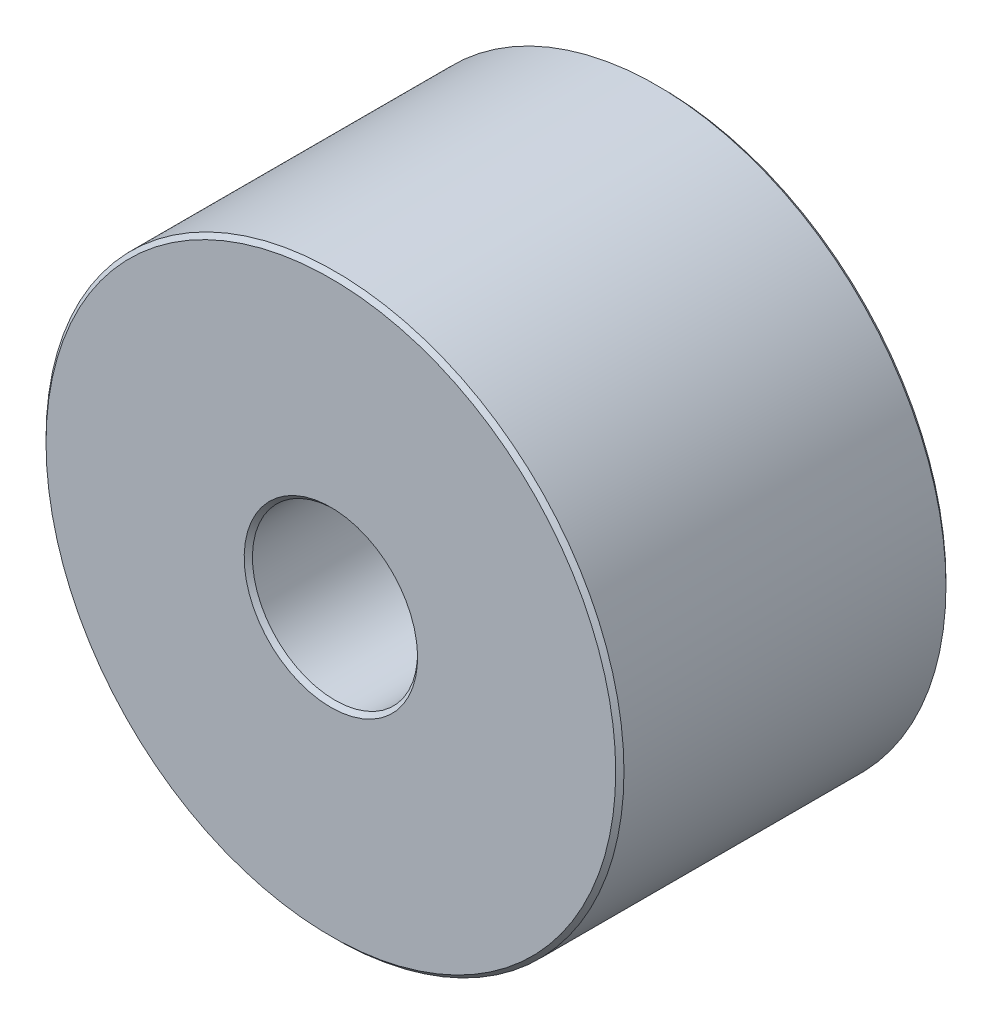
ISO-10303-21;
HEADER;
FILE_DESCRIPTION(('STEP AP214'),'2;1');
FILE_NAME('part.step','',(''),(''),'','','');
FILE_SCHEMA(('AUTOMOTIVE_DESIGN { 1 0 10303 214 1 1 1 1 }'));
ENDSEC;
DATA;
#1=APPLICATION_CONTEXT('core data for automotive mechanical design processes');
#2=APPLICATION_PROTOCOL_DEFINITION('international standard','automotive_design',2000,#1);
#3=PRODUCT_CONTEXT('',#1,'mechanical');
#4=PRODUCT('Part','Part','',(#3));
#5=PRODUCT_RELATED_PRODUCT_CATEGORY('part','',(#4));
#6=PRODUCT_DEFINITION_FORMATION('','',#4);
#7=PRODUCT_DEFINITION_CONTEXT('part definition',#1,'design');
#8=PRODUCT_DEFINITION('design','',#6,#7);
#9=PRODUCT_DEFINITION_SHAPE('','',#8);
#10=(LENGTH_UNIT() NAMED_UNIT(*) SI_UNIT(.MILLI.,.METRE.));
#11=(NAMED_UNIT(*) PLANE_ANGLE_UNIT() SI_UNIT($,.RADIAN.));
#12=(NAMED_UNIT(*) SI_UNIT($,.STERADIAN.) SOLID_ANGLE_UNIT());
#13=UNCERTAINTY_MEASURE_WITH_UNIT(LENGTH_MEASURE(1.E-05),#10,'distance_accuracy_value','');
#14=(GEOMETRIC_REPRESENTATION_CONTEXT(3) GLOBAL_UNCERTAINTY_ASSIGNED_CONTEXT((#13)) GLOBAL_UNIT_ASSIGNED_CONTEXT((#10,
#11,#12)) REPRESENTATION_CONTEXT('',''));
#15=CARTESIAN_POINT('',(0.,0.,0.));
#16=DIRECTION('',(0.,0.,1.));
#17=DIRECTION('',(1.,0.,0.));
#18=AXIS2_PLACEMENT_3D('',#15,#16,#17);
#19=CARTESIAN_POINT('',(0.,0.,15.8));
#20=DIRECTION('',(0.,0.,1.));
#21=DIRECTION('',(0.,-1.,0.));
#22=AXIS2_PLACEMENT_3D('',#19,#20,#21);
#23=CONICAL_SURFACE('',#22,4.,0.78539816339744);
#24=CARTESIAN_POINT('',(0.,0.,16.));
#25=DIRECTION('',(0.,0.,-1.));
#26=DIRECTION('',(0.,-1.,0.));
#27=AXIS2_PLACEMENT_3D('',#24,#25,#26);
#28=CIRCLE('',#27,4.2);
#29=CARTESIAN_POINT('',(0.,-4.2,16.));
#30=VERTEX_POINT('',#29);
#31=EDGE_CURVE('E252',#30,#30,#28,.T.);
#32=ORIENTED_EDGE('',*,*,#31,.F.);
#33=DIRECTION('',(0.,0.707106781186548,-0.707106781186548));
#34=VECTOR('',#33,1.);
#35=CARTESIAN_POINT('',(0.,-4.2,16.));
#36=LINE('',#35,#34);
#37=CARTESIAN_POINT('',(0.,-4.,15.8));
#38=VERTEX_POINT('',#37);
#39=EDGE_CURVE('E11',#30,#38,#36,.T.);
#40=ORIENTED_EDGE('',*,*,#39,.T.);
#41=CARTESIAN_POINT('',(0.,0.,15.8));
#42=DIRECTION('',(0.,0.,-1.));
#43=DIRECTION('',(0.,-1.,0.));
#44=AXIS2_PLACEMENT_3D('',#41,#42,#43);
#45=CIRCLE('',#44,4.);
#46=EDGE_CURVE('E178',#38,#38,#45,.T.);
#47=ORIENTED_EDGE('',*,*,#46,.T.);
#48=ORIENTED_EDGE('',*,*,#39,.F.);
#49=EDGE_LOOP('',(#32,#40,#47,#48));
#50=FACE_BOUND('',#49,.T.);
#51=ADVANCED_FACE('F16',(#50),#23,.F.);
#52=CARTESIAN_POINT('',(0.,0.,16.));
#53=DIRECTION('',(0.,0.,-1.));
#54=DIRECTION('',(-1.,0.,0.));
#55=AXIS2_PLACEMENT_3D('',#52,#53,#54);
#56=CONICAL_SURFACE('',#55,13.8,0.78539816339745);
#57=CARTESIAN_POINT('',(0.,0.,16.));
#58=DIRECTION('',(0.,0.,1.));
#59=DIRECTION('',(-1.,0.,0.));
#60=AXIS2_PLACEMENT_3D('',#57,#58,#59);
#61=CIRCLE('',#60,13.8);
#62=CARTESIAN_POINT('',(-13.8,0.,16.));
#63=VERTEX_POINT('',#62);
#64=EDGE_CURVE('E260',#63,#63,#61,.T.);
#65=ORIENTED_EDGE('',*,*,#64,.F.);
#66=DIRECTION('',(-0.707106781186548,0.,-0.707106781186548));
#67=VECTOR('',#66,1.);
#68=CARTESIAN_POINT('',(-13.8,0.,16.));
#69=LINE('',#68,#67);
#70=CARTESIAN_POINT('',(-14.,0.,15.8));
#71=VERTEX_POINT('',#70);
#72=EDGE_CURVE('E27',#63,#71,#69,.T.);
#73=ORIENTED_EDGE('',*,*,#72,.T.);
#74=CARTESIAN_POINT('',(0.,0.,15.8));
#75=DIRECTION('',(0.,0.,1.));
#76=DIRECTION('',(-1.,0.,0.));
#77=AXIS2_PLACEMENT_3D('',#74,#75,#76);
#78=CIRCLE('',#77,14.);
#79=EDGE_CURVE('E256',#71,#71,#78,.T.);
#80=ORIENTED_EDGE('',*,*,#79,.T.);
#81=ORIENTED_EDGE('',*,*,#72,.F.);
#82=EDGE_LOOP('',(#65,#73,#80,#81));
#83=FACE_BOUND('',#82,.T.);
#84=ADVANCED_FACE('F576',(#83),#56,.T.);
#85=CARTESIAN_POINT('',(-11.5,0.,7.8));
#86=DIRECTION('',(0.,0.,1.));
#87=DIRECTION('',(1.,0.,0.));
#88=AXIS2_PLACEMENT_3D('',#85,#86,#87);
#89=PLANE('',#88);
#90=CARTESIAN_POINT('',(-11.5,0.,7.8));
#91=DIRECTION('',(0.,0.,-1.));
#92=DIRECTION('',(1.,0.,0.));
#93=AXIS2_PLACEMENT_3D('',#90,#91,#92);
#94=CIRCLE('',#93,0.75071615529484);
#95=CARTESIAN_POINT('',(-10.749283844705,0.,7.8));
#96=VERTEX_POINT('',#95);
#97=EDGE_CURVE('E211',#96,#96,#94,.T.);
#98=ORIENTED_EDGE('',*,*,#97,.T.);
#99=EDGE_LOOP('',(#98));
#100=FACE_BOUND('',#99,.T.);
#101=ADVANCED_FACE('F696',(#100),#89,.F.);
#102=CARTESIAN_POINT('',(5.75,9.9592921435211,7.8));
#103=DIRECTION('',(0.,0.,1.));
#104=DIRECTION('',(0.,-1.,0.));
#105=AXIS2_PLACEMENT_3D('',#102,#103,#104);
#106=PLANE('',#105);
#107=CARTESIAN_POINT('',(5.75,9.9592921435211,7.8));
#108=DIRECTION('',(0.,0.,-1.));
#109=DIRECTION('',(1.,0.,0.));
#110=AXIS2_PLACEMENT_3D('',#107,#108,#109);
#111=CIRCLE('',#110,0.75071615529485);
#112=CARTESIAN_POINT('',(6.5007161552948,9.9592921435211,7.8));
#113=VERTEX_POINT('',#112);
#114=EDGE_CURVE('E238',#113,#113,#111,.T.);
#115=ORIENTED_EDGE('',*,*,#114,.T.);
#116=EDGE_LOOP('',(#115));
#117=FACE_BOUND('',#116,.T.);
#118=ADVANCED_FACE('F739',(#117),#106,.F.);
#119=CARTESIAN_POINT('',(5.75,-9.959292143521,7.8));
#120=DIRECTION('',(0.,0.,1.));
#121=DIRECTION('',(1.,0.,0.));
#122=AXIS2_PLACEMENT_3D('',#119,#120,#121);
#123=PLANE('',#122);
#124=CARTESIAN_POINT('',(5.75,-9.959292143521,7.8000000000001));
#125=DIRECTION('',(0.,0.,-1.));
#126=DIRECTION('',(1.,0.,0.));
#127=AXIS2_PLACEMENT_3D('',#124,#125,#126);
#128=CIRCLE('',#127,0.75071615529484);
#129=CARTESIAN_POINT('',(6.5007161552948,-9.959292143521,7.8000000000001));
#130=VERTEX_POINT('',#129);
#131=EDGE_CURVE('E239',#130,#130,#128,.T.);
#132=ORIENTED_EDGE('',*,*,#131,.T.);
#133=EDGE_LOOP('',(#132));
#134=FACE_BOUND('',#133,.T.);
#135=ADVANCED_FACE('F528',(#134),#123,.F.);
#136=CARTESIAN_POINT('',(-5.25,9.0932667397366,7.8));
#137=DIRECTION('',(0.,0.,1.));
#138=DIRECTION('',(1.,0.,0.));
#139=AXIS2_PLACEMENT_3D('',#136,#137,#138);
#140=PLANE('',#139);
#141=CARTESIAN_POINT('',(-5.25,9.0932667397366,7.8));
#142=DIRECTION('',(0.,0.,-1.));
#143=DIRECTION('',(1.,0.,0.));
#144=AXIS2_PLACEMENT_3D('',#141,#142,#143);
#145=CIRCLE('',#144,0.75071615529501);
#146=CARTESIAN_POINT('',(-4.499283844705,9.0932667397366,7.8));
#147=VERTEX_POINT('',#146);
#148=EDGE_CURVE('E218',#147,#147,#145,.T.);
#149=ORIENTED_EDGE('',*,*,#148,.T.);
#150=EDGE_LOOP('',(#149));
#151=FACE_BOUND('',#150,.T.);
#152=ADVANCED_FACE('F522',(#151),#140,.F.);
#153=CARTESIAN_POINT('',(10.5,0.,7.8));
#154=DIRECTION('',(0.,0.,1.));
#155=DIRECTION('',(1.,0.,0.));
#156=AXIS2_PLACEMENT_3D('',#153,#154,#155);
#157=PLANE('',#156);
#158=CARTESIAN_POINT('',(10.5,0.,7.8));
#159=DIRECTION('',(0.,0.,-1.));
#160=DIRECTION('',(1.,0.,0.));
#161=AXIS2_PLACEMENT_3D('',#158,#159,#160);
#162=CIRCLE('',#161,0.75071615529501);
#163=CARTESIAN_POINT('',(11.250716155295,0.,7.8));
#164=VERTEX_POINT('',#163);
#165=EDGE_CURVE('E244',#164,#164,#162,.T.);
#166=ORIENTED_EDGE('',*,*,#165,.T.);
#167=EDGE_LOOP('',(#166));
#168=FACE_BOUND('',#167,.T.);
#169=ADVANCED_FACE('F527',(#168),#157,.F.);
#170=CARTESIAN_POINT('',(-5.25,-9.0932667397366,7.8));
#171=DIRECTION('',(0.,0.,1.));
#172=DIRECTION('',(1.,0.,0.));
#173=AXIS2_PLACEMENT_3D('',#170,#171,#172);
#174=PLANE('',#173);
#175=CARTESIAN_POINT('',(-5.25,-9.0932667397366,7.8));
#176=DIRECTION('',(0.,0.,-1.));
#177=DIRECTION('',(1.,0.,0.));
#178=AXIS2_PLACEMENT_3D('',#175,#176,#177);
#179=CIRCLE('',#178,0.75071615529501);
#180=CARTESIAN_POINT('',(-4.499283844705,-9.0932667397366,7.8));
#181=VERTEX_POINT('',#180);
#182=EDGE_CURVE('E217',#181,#181,#179,.T.);
#183=ORIENTED_EDGE('',*,*,#182,.T.);
#184=EDGE_LOOP('',(#183));
#185=FACE_BOUND('',#184,.T.);
#186=ADVANCED_FACE('F730',(#185),#174,.F.);
#187=CARTESIAN_POINT('',(3.7512886940357,0.,16.));
#188=DIRECTION('',(0.,0.,1.));
#189=DIRECTION('',(1.,0.,0.));
#190=AXIS2_PLACEMENT_3D('',#187,#188,#189);
#191=PLANE('',#190);
#192=ORIENTED_EDGE('',*,*,#31,.T.);
#193=EDGE_LOOP('',(#192));
#194=FACE_BOUND('',#193,.T.);
#195=ORIENTED_EDGE('',*,*,#64,.T.);
#196=EDGE_LOOP('',(#195));
#197=FACE_BOUND('',#196,.T.);
#198=ADVANCED_FACE('F719',(#194,#197),#191,.T.);
#199=CARTESIAN_POINT('',(0.,0.,16.));
#200=DIRECTION('',(0.,0.,-1.));
#201=DIRECTION('',(-1.,0.,0.));
#202=AXIS2_PLACEMENT_3D('',#199,#200,#201);
#203=CYLINDRICAL_SURFACE('',#202,14.);
#204=CARTESIAN_POINT('',(0.,0.,0.2));
#205=DIRECTION('',(0.,0.,-1.));
#206=DIRECTION('',(1.,0.,0.));
#207=AXIS2_PLACEMENT_3D('',#204,#205,#206);
#208=CIRCLE('',#207,14.);
#209=CARTESIAN_POINT('',(14.,0.,0.2));
#210=VERTEX_POINT('',#209);
#211=CARTESIAN_POINT('',(-14.,0.,0.2));
#212=VERTEX_POINT('',#211);
#213=EDGE_CURVE('E297',#210,#212,#208,.T.);
#214=ORIENTED_EDGE('',*,*,#213,.F.);
#215=CARTESIAN_POINT('',(0.,0.,0.2));
#216=DIRECTION('',(0.,0.,-1.));
#217=DIRECTION('',(-1.,0.,0.));
#218=AXIS2_PLACEMENT_3D('',#215,#216,#217);
#219=CIRCLE('',#218,14.);
#220=EDGE_CURVE('E272',#212,#210,#219,.T.);
#221=ORIENTED_EDGE('',*,*,#220,.F.);
#222=DIRECTION('',(0.,0.,-1.));
#223=VECTOR('',#222,1.);
#224=CARTESIAN_POINT('',(-14.,0.,15.8));
#225=LINE('',#224,#223);
#226=EDGE_CURVE('E261',#71,#212,#225,.T.);
#227=ORIENTED_EDGE('',*,*,#226,.F.);
#228=ORIENTED_EDGE('',*,*,#79,.F.);
#229=ORIENTED_EDGE('',*,*,#226,.T.);
#230=EDGE_LOOP('',(#214,#221,#227,#228,#229));
#231=FACE_BOUND('',#230,.T.);
#232=ADVANCED_FACE('F331',(#231),#203,.T.);
#233=CARTESIAN_POINT('',(-5.25,-9.0932667397366,0.35));
#234=DIRECTION('',(0.,0.,-1.));
#235=DIRECTION('',(1.,0.,0.));
#236=AXIS2_PLACEMENT_3D('',#233,#234,#235);
#237=CONICAL_SURFACE('',#236,0.999999999999983,0.78539816339744);
#238=DIRECTION('',(-0.707106781186548,0.,0.707106781186548));
#239=VECTOR('',#238,1.);
#240=CARTESIAN_POINT('',(-3.9,-9.0932667397366,0.));
#241=LINE('',#240,#239);
#242=CARTESIAN_POINT('',(-3.9,-9.0932667397366,0.));
#243=VERTEX_POINT('',#242);
#244=CARTESIAN_POINT('',(-4.,-9.0932667397366,0.1));
#245=VERTEX_POINT('',#244);
#246=EDGE_CURVE('E284',#243,#245,#241,.T.);
#247=ORIENTED_EDGE('',*,*,#246,.T.);
#248=CARTESIAN_POINT('',(-5.25,-9.0932667397366,0.1));
#249=DIRECTION('',(0.,0.,-1.));
#250=DIRECTION('',(1.,0.,0.));
#251=AXIS2_PLACEMENT_3D('',#248,#249,#250);
#252=CIRCLE('',#251,1.25);
#253=EDGE_CURVE('E201',#245,#245,#252,.T.);
#254=ORIENTED_EDGE('',*,*,#253,.F.);
#255=ORIENTED_EDGE('',*,*,#246,.F.);
#256=CARTESIAN_POINT('',(-5.25,-9.0932667397366,0.));
#257=DIRECTION('',(0.,0.,1.));
#258=DIRECTION('',(1.,0.,0.));
#259=AXIS2_PLACEMENT_3D('',#256,#257,#258);
#260=CIRCLE('',#259,1.35);
#261=EDGE_CURVE('E245',#243,#243,#260,.T.);
#262=ORIENTED_EDGE('',*,*,#261,.F.);
#263=EDGE_LOOP('',(#247,#254,#255,#262));
#264=FACE_BOUND('',#263,.T.);
#265=ADVANCED_FACE('F651',(#264),#237,.F.);
#266=CARTESIAN_POINT('',(10.5,0.,0.3499999999999));
#267=DIRECTION('',(0.,0.,-1.));
#268=DIRECTION('',(1.,0.,0.));
#269=AXIS2_PLACEMENT_3D('',#266,#267,#268);
#270=CONICAL_SURFACE('',#269,1.00000000000006,0.78539816339748);
#271=DIRECTION('',(-0.707106781186548,0.,0.707106781186548));
#272=VECTOR('',#271,1.);
#273=CARTESIAN_POINT('',(11.85,0.,0.));
#274=LINE('',#273,#272);
#275=CARTESIAN_POINT('',(11.85,0.,0.));
#276=VERTEX_POINT('',#275);
#277=CARTESIAN_POINT('',(11.75,0.,0.1));
#278=VERTEX_POINT('',#277);
#279=EDGE_CURVE('E287',#276,#278,#274,.T.);
#280=ORIENTED_EDGE('',*,*,#279,.T.);
#281=CARTESIAN_POINT('',(10.5,0.,0.1));
#282=DIRECTION('',(0.,0.,-1.));
#283=DIRECTION('',(1.,0.,0.));
#284=AXIS2_PLACEMENT_3D('',#281,#282,#283);
#285=CIRCLE('',#284,1.25);
#286=EDGE_CURVE('E280',#278,#278,#285,.T.);
#287=ORIENTED_EDGE('',*,*,#286,.F.);
#288=ORIENTED_EDGE('',*,*,#279,.F.);
#289=CARTESIAN_POINT('',(10.5,0.,0.));
#290=DIRECTION('',(0.,0.,1.));
#291=DIRECTION('',(1.,0.,0.));
#292=AXIS2_PLACEMENT_3D('',#289,#290,#291);
#293=CIRCLE('',#292,1.35);
#294=EDGE_CURVE('E249',#276,#276,#293,.T.);
#295=ORIENTED_EDGE('',*,*,#294,.F.);
#296=EDGE_LOOP('',(#280,#287,#288,#295));
#297=FACE_BOUND('',#296,.T.);
#298=ADVANCED_FACE('F627',(#297),#270,.F.);
#299=CARTESIAN_POINT('',(-5.25,9.0932667397366,0.35));
#300=DIRECTION('',(0.,0.,-1.));
#301=DIRECTION('',(1.,0.,0.));
#302=AXIS2_PLACEMENT_3D('',#299,#300,#301);
#303=CONICAL_SURFACE('',#302,1.,0.78539816339745);
#304=DIRECTION('',(-0.707106781186548,0.,0.707106781186548));
#305=VECTOR('',#304,1.);
#306=CARTESIAN_POINT('',(-3.9,9.0932667397366,0.));
#307=LINE('',#306,#305);
#308=CARTESIAN_POINT('',(-3.9,9.0932667397366,0.));
#309=VERTEX_POINT('',#308);
#310=CARTESIAN_POINT('',(-4.,9.0932667397366,0.1));
#311=VERTEX_POINT('',#310);
#312=EDGE_CURVE('E350',#309,#311,#307,.T.);
#313=ORIENTED_EDGE('',*,*,#312,.T.);
#314=CARTESIAN_POINT('',(-5.25,9.0932667397366,0.1));
#315=DIRECTION('',(0.,0.,-1.));
#316=DIRECTION('',(1.,0.,0.));
#317=AXIS2_PLACEMENT_3D('',#314,#315,#316);
#318=CIRCLE('',#317,1.25);
#319=EDGE_CURVE('E190',#311,#311,#318,.T.);
#320=ORIENTED_EDGE('',*,*,#319,.F.);
#321=ORIENTED_EDGE('',*,*,#312,.F.);
#322=CARTESIAN_POINT('',(-5.25,9.0932667397366,0.));
#323=DIRECTION('',(0.,0.,1.));
#324=DIRECTION('',(1.,0.,0.));
#325=AXIS2_PLACEMENT_3D('',#322,#323,#324);
#326=CIRCLE('',#325,1.35);
#327=EDGE_CURVE('E293',#309,#309,#326,.T.);
#328=ORIENTED_EDGE('',*,*,#327,.F.);
#329=EDGE_LOOP('',(#313,#320,#321,#328));
#330=FACE_BOUND('',#329,.T.);
#331=ADVANCED_FACE('F621',(#330),#303,.F.);
#332=CARTESIAN_POINT('',(5.75,-9.959292143521,0.35));
#333=DIRECTION('',(0.,0.,-1.));
#334=DIRECTION('',(1.,0.,0.));
#335=AXIS2_PLACEMENT_3D('',#332,#333,#334);
#336=CONICAL_SURFACE('',#335,1.00000000000002,0.78539816339746);
#337=DIRECTION('',(-0.707106781186548,0.,0.707106781186548));
#338=VECTOR('',#337,1.);
#339=CARTESIAN_POINT('',(7.1,-9.959292143521,0.));
#340=LINE('',#339,#338);
#341=CARTESIAN_POINT('',(7.1,-9.959292143521,0.));
#342=VERTEX_POINT('',#341);
#343=CARTESIAN_POINT('',(7.,-9.959292143521,0.1));
#344=VERTEX_POINT('',#343);
#345=EDGE_CURVE('E360',#342,#344,#340,.T.);
#346=ORIENTED_EDGE('',*,*,#345,.T.);
#347=CARTESIAN_POINT('',(5.75,-9.959292143521,0.1));
#348=DIRECTION('',(0.,0.,-1.));
#349=DIRECTION('',(1.,0.,0.));
#350=AXIS2_PLACEMENT_3D('',#347,#348,#349);
#351=CIRCLE('',#350,1.25);
#352=EDGE_CURVE('E206',#344,#344,#351,.T.);
#353=ORIENTED_EDGE('',*,*,#352,.F.);
#354=ORIENTED_EDGE('',*,*,#345,.F.);
#355=CARTESIAN_POINT('',(5.75,-9.959292143521,0.));
#356=DIRECTION('',(0.,0.,1.));
#357=DIRECTION('',(1.,0.,0.));
#358=AXIS2_PLACEMENT_3D('',#355,#356,#357);
#359=CIRCLE('',#358,1.35);
#360=EDGE_CURVE('E288',#342,#342,#359,.T.);
#361=ORIENTED_EDGE('',*,*,#360,.F.);
#362=EDGE_LOOP('',(#346,#353,#354,#361));
#363=FACE_BOUND('',#362,.T.);
#364=ADVANCED_FACE('F626',(#363),#336,.F.);
#365=CARTESIAN_POINT('',(5.75,9.9592921435211,0.35));
#366=DIRECTION('',(0.,0.,-1.));
#367=DIRECTION('',(1.,0.,0.));
#368=AXIS2_PLACEMENT_3D('',#365,#366,#367);
#369=CONICAL_SURFACE('',#368,1.00000000000002,0.78539816339746);
#370=DIRECTION('',(-0.707106781186548,0.,0.707106781186548));
#371=VECTOR('',#370,1.);
#372=CARTESIAN_POINT('',(7.1,9.9592921435211,0.));
#373=LINE('',#372,#371);
#374=CARTESIAN_POINT('',(7.1,9.9592921435211,0.));
#375=VERTEX_POINT('',#374);
#376=CARTESIAN_POINT('',(7.,9.9592921435211,0.1));
#377=VERTEX_POINT('',#376);
#378=EDGE_CURVE('E243',#375,#377,#373,.T.);
#379=ORIENTED_EDGE('',*,*,#378,.T.);
#380=CARTESIAN_POINT('',(5.75,9.9592921435211,0.1));
#381=DIRECTION('',(0.,0.,-1.));
#382=DIRECTION('',(1.,0.,0.));
#383=AXIS2_PLACEMENT_3D('',#380,#381,#382);
#384=CIRCLE('',#383,1.25);
#385=EDGE_CURVE('E356',#377,#377,#384,.T.);
#386=ORIENTED_EDGE('',*,*,#385,.F.);
#387=ORIENTED_EDGE('',*,*,#378,.F.);
#388=CARTESIAN_POINT('',(5.75,9.9592921435211,0.));
#389=DIRECTION('',(0.,0.,1.));
#390=DIRECTION('',(1.,0.,0.));
#391=AXIS2_PLACEMENT_3D('',#388,#389,#390);
#392=CIRCLE('',#391,1.35);
#393=EDGE_CURVE('E292',#375,#375,#392,.T.);
#394=ORIENTED_EDGE('',*,*,#393,.F.);
#395=EDGE_LOOP('',(#379,#386,#387,#394));
#396=FACE_BOUND('',#395,.T.);
#397=ADVANCED_FACE('F396',(#396),#369,.F.);
#398=CARTESIAN_POINT('',(-11.5,0.,0.35));
#399=DIRECTION('',(0.,0.,-1.));
#400=DIRECTION('',(1.,0.,0.));
#401=AXIS2_PLACEMENT_3D('',#398,#399,#400);
#402=CONICAL_SURFACE('',#401,0.999999999999983,0.78539816339744);
#403=DIRECTION('',(-0.707106781186548,0.,0.707106781186548));
#404=VECTOR('',#403,1.);
#405=CARTESIAN_POINT('',(-10.15,0.,0.));
#406=LINE('',#405,#404);
#407=CARTESIAN_POINT('',(-10.15,0.,0.));
#408=VERTEX_POINT('',#407);
#409=CARTESIAN_POINT('',(-10.25,0.,0.1));
#410=VERTEX_POINT('',#409);
#411=EDGE_CURVE('E240',#408,#410,#406,.T.);
#412=ORIENTED_EDGE('',*,*,#411,.T.);
#413=CARTESIAN_POINT('',(-11.5,0.,0.1));
#414=DIRECTION('',(0.,0.,-1.));
#415=DIRECTION('',(1.,0.,0.));
#416=AXIS2_PLACEMENT_3D('',#413,#414,#415);
#417=CIRCLE('',#416,1.25);
#418=EDGE_CURVE('E222',#410,#410,#417,.T.);
#419=ORIENTED_EDGE('',*,*,#418,.F.);
#420=ORIENTED_EDGE('',*,*,#411,.F.);
#421=CARTESIAN_POINT('',(-11.5,0.,0.));
#422=DIRECTION('',(0.,0.,1.));
#423=DIRECTION('',(1.,0.,0.));
#424=AXIS2_PLACEMENT_3D('',#421,#422,#423);
#425=CIRCLE('',#424,1.35);
#426=EDGE_CURVE('E269',#408,#408,#425,.T.);
#427=ORIENTED_EDGE('',*,*,#426,.F.);
#428=EDGE_LOOP('',(#412,#419,#420,#427));
#429=FACE_BOUND('',#428,.T.);
#430=ADVANCED_FACE('F510',(#429),#402,.F.);
#431=CARTESIAN_POINT('',(10.5,0.,7.2510757737845));
#432=DIRECTION('',(0.,0.,-1.));
#433=DIRECTION('',(1.,0.,0.));
#434=AXIS2_PLACEMENT_3D('',#431,#432,#433);
#435=CONICAL_SURFACE('',#434,1.66427948235069,1.0297442586767);
#436=DIRECTION('',(-0.857167300702042,0.,0.515038074910171));
#437=VECTOR('',#436,1.);
#438=CARTESIAN_POINT('',(11.75,0.,7.5));
#439=LINE('',#438,#437);
#440=CARTESIAN_POINT('',(11.75,0.,7.5));
#441=VERTEX_POINT('',#440);
#442=EDGE_CURVE('E283',#441,#164,#439,.T.);
#443=ORIENTED_EDGE('',*,*,#442,.T.);
#444=ORIENTED_EDGE('',*,*,#165,.F.);
#445=ORIENTED_EDGE('',*,*,#442,.F.);
#446=CARTESIAN_POINT('',(10.5,0.,7.5));
#447=DIRECTION('',(0.,0.,1.));
#448=DIRECTION('',(1.,0.,0.));
#449=AXIS2_PLACEMENT_3D('',#446,#447,#448);
#450=CIRCLE('',#449,1.25);
#451=EDGE_CURVE('E212',#441,#441,#450,.T.);
#452=ORIENTED_EDGE('',*,*,#451,.F.);
#453=EDGE_LOOP('',(#443,#444,#445,#452));
#454=FACE_BOUND('',#453,.T.);
#455=ADVANCED_FACE('F503',(#454),#435,.F.);
#456=CARTESIAN_POINT('',(5.75,9.9592921435211,7.2510757737844));
#457=DIRECTION('',(0.,0.,-1.));
#458=DIRECTION('',(1.,0.,0.));
#459=AXIS2_PLACEMENT_3D('',#456,#457,#458);
#460=CONICAL_SURFACE('',#459,1.66427948235069,1.0297442586767);
#461=DIRECTION('',(-0.857167300702121,0.,0.51503807491004));
#462=VECTOR('',#461,1.);
#463=CARTESIAN_POINT('',(7.,9.9592921435211,7.5));
#464=LINE('',#463,#462);
#465=CARTESIAN_POINT('',(7.,9.9592921435211,7.5));
#466=VERTEX_POINT('',#465);
#467=EDGE_CURVE('E234',#466,#113,#464,.T.);
#468=ORIENTED_EDGE('',*,*,#467,.T.);
#469=ORIENTED_EDGE('',*,*,#114,.F.);
#470=ORIENTED_EDGE('',*,*,#467,.F.);
#471=CARTESIAN_POINT('',(5.75,9.9592921435211,7.5));
#472=DIRECTION('',(0.,0.,1.));
#473=DIRECTION('',(1.,0.,0.));
#474=AXIS2_PLACEMENT_3D('',#471,#472,#473);
#475=CIRCLE('',#474,1.25);
#476=EDGE_CURVE('E20',#466,#466,#475,.T.);
#477=ORIENTED_EDGE('',*,*,#476,.F.);
#478=EDGE_LOOP('',(#468,#469,#470,#477));
#479=FACE_BOUND('',#478,.T.);
#480=ADVANCED_FACE('F509',(#479),#460,.F.);
#481=CARTESIAN_POINT('',(5.75,-9.959292143521,7.2510757737845));
#482=DIRECTION('',(0.,0.,-1.));
#483=DIRECTION('',(1.,0.,0.));
#484=AXIS2_PLACEMENT_3D('',#481,#482,#483);
#485=CONICAL_SURFACE('',#484,1.66427948235069,1.0297442586767);
#486=DIRECTION('',(-0.857167300702098,0.,0.515038074910079));
#487=VECTOR('',#486,1.);
#488=CARTESIAN_POINT('',(7.,-9.959292143521,7.5));
#489=LINE('',#488,#487);
#490=CARTESIAN_POINT('',(7.,-9.959292143521,7.5));
#491=VERTEX_POINT('',#490);
#492=EDGE_CURVE('E264',#491,#130,#489,.T.);
#493=ORIENTED_EDGE('',*,*,#492,.T.);
#494=ORIENTED_EDGE('',*,*,#131,.F.);
#495=ORIENTED_EDGE('',*,*,#492,.F.);
#496=CARTESIAN_POINT('',(5.75,-9.959292143521,7.5));
#497=DIRECTION('',(0.,0.,1.));
#498=DIRECTION('',(1.,0.,0.));
#499=AXIS2_PLACEMENT_3D('',#496,#497,#498);
#500=CIRCLE('',#499,1.25);
#501=EDGE_CURVE('E202',#491,#491,#500,.T.);
#502=ORIENTED_EDGE('',*,*,#501,.F.);
#503=EDGE_LOOP('',(#493,#494,#495,#502));
#504=FACE_BOUND('',#503,.T.);
#505=ADVANCED_FACE('F548',(#504),#485,.F.);
#506=CARTESIAN_POINT('',(-5.25,-9.0932667397366,7.2510757737845));
#507=DIRECTION('',(0.,0.,-1.));
#508=DIRECTION('',(1.,0.,0.));
#509=AXIS2_PLACEMENT_3D('',#506,#507,#508);
#510=CONICAL_SURFACE('',#509,1.66427948235069,1.0297442586767);
#511=DIRECTION('',(-0.857167300702098,0.,0.515038074910079));
#512=VECTOR('',#511,1.);
#513=CARTESIAN_POINT('',(-4.,-9.0932667397366,7.5));
#514=LINE('',#513,#512);
#515=CARTESIAN_POINT('',(-4.,-9.0932667397366,7.5));
#516=VERTEX_POINT('',#515);
#517=EDGE_CURVE('E213',#516,#181,#514,.T.);
#518=ORIENTED_EDGE('',*,*,#517,.T.);
#519=ORIENTED_EDGE('',*,*,#182,.F.);
#520=ORIENTED_EDGE('',*,*,#517,.F.);
#521=CARTESIAN_POINT('',(-5.25,-9.0932667397366,7.5));
#522=DIRECTION('',(0.,0.,1.));
#523=DIRECTION('',(1.,0.,0.));
#524=AXIS2_PLACEMENT_3D('',#521,#522,#523);
#525=CIRCLE('',#524,1.25);
#526=EDGE_CURVE('E196',#516,#516,#525,.T.);
#527=ORIENTED_EDGE('',*,*,#526,.F.);
#528=EDGE_LOOP('',(#518,#519,#520,#527));
#529=FACE_BOUND('',#528,.T.);
#530=ADVANCED_FACE('F553',(#529),#510,.F.);
#531=CARTESIAN_POINT('',(-5.25,9.0932667397366,7.2510757737845));
#532=DIRECTION('',(0.,0.,-1.));
#533=DIRECTION('',(1.,0.,0.));
#534=AXIS2_PLACEMENT_3D('',#531,#532,#533);
#535=CONICAL_SURFACE('',#534,1.66427948235069,1.0297442586767);
#536=DIRECTION('',(-0.857167300702098,0.,0.515038074910079));
#537=VECTOR('',#536,1.);
#538=CARTESIAN_POINT('',(-4.,9.0932667397366,7.5));
#539=LINE('',#538,#537);
#540=CARTESIAN_POINT('',(-4.,9.0932667397366,7.5));
#541=VERTEX_POINT('',#540);
#542=EDGE_CURVE('E220',#541,#147,#539,.T.);
#543=ORIENTED_EDGE('',*,*,#542,.T.);
#544=ORIENTED_EDGE('',*,*,#148,.F.);
#545=ORIENTED_EDGE('',*,*,#542,.F.);
#546=CARTESIAN_POINT('',(-5.25,9.0932667397366,7.5));
#547=DIRECTION('',(0.,0.,1.));
#548=DIRECTION('',(1.,0.,0.));
#549=AXIS2_PLACEMENT_3D('',#546,#547,#548);
#550=CIRCLE('',#549,1.25);
#551=EDGE_CURVE('E194',#541,#541,#550,.T.);
#552=ORIENTED_EDGE('',*,*,#551,.F.);
#553=EDGE_LOOP('',(#543,#544,#545,#552));
#554=FACE_BOUND('',#553,.T.);
#555=ADVANCED_FACE('F309',(#554),#535,.F.);
#556=CARTESIAN_POINT('',(-11.5,0.,7.2510757737844));
#557=DIRECTION('',(0.,0.,-1.));
#558=DIRECTION('',(1.,0.,0.));
#559=AXIS2_PLACEMENT_3D('',#556,#557,#558);
#560=CONICAL_SURFACE('',#559,1.66427948235069,1.0297442586767);
#561=DIRECTION('',(-0.857167300702098,0.,0.515038074910079));
#562=VECTOR('',#561,1.);
#563=CARTESIAN_POINT('',(-10.25,0.,7.5));
#564=LINE('',#563,#562);
#565=CARTESIAN_POINT('',(-10.25,0.,7.5));
#566=VERTEX_POINT('',#565);
#567=EDGE_CURVE('E207',#566,#96,#564,.T.);
#568=ORIENTED_EDGE('',*,*,#567,.T.);
#569=ORIENTED_EDGE('',*,*,#97,.F.);
#570=ORIENTED_EDGE('',*,*,#567,.F.);
#571=CARTESIAN_POINT('',(-11.5,0.,7.5));
#572=DIRECTION('',(0.,0.,1.));
#573=DIRECTION('',(1.,0.,0.));
#574=AXIS2_PLACEMENT_3D('',#571,#572,#573);
#575=CIRCLE('',#574,1.25);
#576=EDGE_CURVE('E226',#566,#566,#575,.T.);
#577=ORIENTED_EDGE('',*,*,#576,.F.);
#578=EDGE_LOOP('',(#568,#569,#570,#577));
#579=FACE_BOUND('',#578,.T.);
#580=ADVANCED_FACE('F598',(#579),#560,.F.);
#581=CARTESIAN_POINT('',(10.5,0.,0.1));
#582=DIRECTION('',(0.,0.,1.));
#583=DIRECTION('',(1.,0.,0.));
#584=AXIS2_PLACEMENT_3D('',#581,#582,#583);
#585=CYLINDRICAL_SURFACE('',#584,1.25);
#586=DIRECTION('',(0.,0.,-1.));
#587=VECTOR('',#586,1.);
#588=CARTESIAN_POINT('',(11.75,0.,7.5));
#589=LINE('',#588,#587);
#590=EDGE_CURVE('E321',#441,#278,#589,.T.);
#591=ORIENTED_EDGE('',*,*,#590,.T.);
#592=ORIENTED_EDGE('',*,*,#286,.T.);
#593=ORIENTED_EDGE('',*,*,#590,.F.);
#594=ORIENTED_EDGE('',*,*,#451,.T.);
#595=EDGE_LOOP('',(#591,#592,#593,#594));
#596=FACE_BOUND('',#595,.T.);
#597=ADVANCED_FACE('F589',(#596),#585,.F.);
#598=CARTESIAN_POINT('',(5.75,9.9592921435211,0.1));
#599=DIRECTION('',(0.,0.,1.));
#600=DIRECTION('',(1.,0.,0.));
#601=AXIS2_PLACEMENT_3D('',#598,#599,#600);
#602=CYLINDRICAL_SURFACE('',#601,1.25);
#603=DIRECTION('',(0.,0.,-1.));
#604=VECTOR('',#603,1.);
#605=CARTESIAN_POINT('',(7.,9.9592921435211,7.5));
#606=LINE('',#605,#604);
#607=EDGE_CURVE('E188',#466,#377,#606,.T.);
#608=ORIENTED_EDGE('',*,*,#607,.T.);
#609=ORIENTED_EDGE('',*,*,#385,.T.);
#610=ORIENTED_EDGE('',*,*,#607,.F.);
#611=ORIENTED_EDGE('',*,*,#476,.T.);
#612=EDGE_LOOP('',(#608,#609,#610,#611));
#613=FACE_BOUND('',#612,.T.);
#614=ADVANCED_FACE('F402',(#613),#602,.F.);
#615=CARTESIAN_POINT('',(5.75,-9.959292143521,0.1));
#616=DIRECTION('',(0.,0.,1.));
#617=DIRECTION('',(1.,0.,0.));
#618=AXIS2_PLACEMENT_3D('',#615,#616,#617);
#619=CYLINDRICAL_SURFACE('',#618,1.25);
#620=DIRECTION('',(0.,0.,-1.));
#621=VECTOR('',#620,1.);
#622=CARTESIAN_POINT('',(7.,-9.959292143521,7.5));
#623=LINE('',#622,#621);
#624=EDGE_CURVE('E200',#491,#344,#623,.T.);
#625=ORIENTED_EDGE('',*,*,#624,.T.);
#626=ORIENTED_EDGE('',*,*,#352,.T.);
#627=ORIENTED_EDGE('',*,*,#624,.F.);
#628=ORIENTED_EDGE('',*,*,#501,.T.);
#629=EDGE_LOOP('',(#625,#626,#627,#628));
#630=FACE_BOUND('',#629,.T.);
#631=ADVANCED_FACE('F588',(#630),#619,.F.);
#632=CARTESIAN_POINT('',(-5.25,-9.0932667397366,0.1));
#633=DIRECTION('',(0.,0.,1.));
#634=DIRECTION('',(1.,0.,0.));
#635=AXIS2_PLACEMENT_3D('',#632,#633,#634);
#636=CYLINDRICAL_SURFACE('',#635,1.25);
#637=DIRECTION('',(0.,0.,-1.));
#638=VECTOR('',#637,1.);
#639=CARTESIAN_POINT('',(-4.,-9.0932667397366,7.5));
#640=LINE('',#639,#638);
#641=EDGE_CURVE('E276',#516,#245,#640,.T.);
#642=ORIENTED_EDGE('',*,*,#641,.T.);
#643=ORIENTED_EDGE('',*,*,#253,.T.);
#644=ORIENTED_EDGE('',*,*,#641,.F.);
#645=ORIENTED_EDGE('',*,*,#526,.T.);
#646=EDGE_LOOP('',(#642,#643,#644,#645));
#647=FACE_BOUND('',#646,.T.);
#648=ADVANCED_FACE('F660',(#647),#636,.F.);
#649=CARTESIAN_POINT('',(-5.25,9.0932667397366,0.1));
#650=DIRECTION('',(0.,0.,1.));
#651=DIRECTION('',(1.,0.,0.));
#652=AXIS2_PLACEMENT_3D('',#649,#650,#651);
#653=CYLINDRICAL_SURFACE('',#652,1.25);
#654=DIRECTION('',(0.,0.,-1.));
#655=VECTOR('',#654,1.);
#656=CARTESIAN_POINT('',(-4.,9.0932667397366,7.5));
#657=LINE('',#656,#655);
#658=EDGE_CURVE('E195',#541,#311,#657,.T.);
#659=ORIENTED_EDGE('',*,*,#658,.T.);
#660=ORIENTED_EDGE('',*,*,#319,.T.);
#661=ORIENTED_EDGE('',*,*,#658,.F.);
#662=ORIENTED_EDGE('',*,*,#551,.T.);
#663=EDGE_LOOP('',(#659,#660,#661,#662));
#664=FACE_BOUND('',#663,.T.);
#665=ADVANCED_FACE('F305',(#664),#653,.F.);
#666=CARTESIAN_POINT('',(-11.5,0.,0.1));
#667=DIRECTION('',(0.,0.,1.));
#668=DIRECTION('',(1.,0.,0.));
#669=AXIS2_PLACEMENT_3D('',#666,#667,#668);
#670=CYLINDRICAL_SURFACE('',#669,1.25);
#671=DIRECTION('',(0.,0.,-1.));
#672=VECTOR('',#671,1.);
#673=CARTESIAN_POINT('',(-10.25,0.,7.5));
#674=LINE('',#673,#672);
#675=EDGE_CURVE('E227',#566,#410,#674,.T.);
#676=ORIENTED_EDGE('',*,*,#675,.T.);
#677=ORIENTED_EDGE('',*,*,#418,.T.);
#678=ORIENTED_EDGE('',*,*,#675,.F.);
#679=ORIENTED_EDGE('',*,*,#576,.T.);
#680=EDGE_LOOP('',(#676,#677,#678,#679));
#681=FACE_BOUND('',#680,.T.);
#682=ADVANCED_FACE('F754',(#681),#670,.F.);
#683=CARTESIAN_POINT('',(-3.7512886940357,0.,0.));
#684=DIRECTION('',(0.,0.,-1.));
#685=DIRECTION('',(0.,-1.,0.));
#686=AXIS2_PLACEMENT_3D('',#683,#684,#685);
#687=PLANE('',#686);
#688=CARTESIAN_POINT('',(0.,0.,0.));
#689=DIRECTION('',(0.,0.,-1.));
#690=DIRECTION('',(0.,-1.,0.));
#691=AXIS2_PLACEMENT_3D('',#688,#689,#690);
#692=CIRCLE('',#691,4.2);
#693=CARTESIAN_POINT('',(0.,-4.2,0.));
#694=VERTEX_POINT('',#693);
#695=EDGE_CURVE('E170',#694,#694,#692,.T.);
#696=ORIENTED_EDGE('',*,*,#695,.F.);
#697=EDGE_LOOP('',(#696));
#698=FACE_BOUND('',#697,.T.);
#699=ORIENTED_EDGE('',*,*,#426,.T.);
#700=EDGE_LOOP('',(#699));
#701=FACE_BOUND('',#700,.T.);
#702=ORIENTED_EDGE('',*,*,#393,.T.);
#703=EDGE_LOOP('',(#702));
#704=FACE_BOUND('',#703,.T.);
#705=ORIENTED_EDGE('',*,*,#360,.T.);
#706=EDGE_LOOP('',(#705));
#707=FACE_BOUND('',#706,.T.);
#708=ORIENTED_EDGE('',*,*,#327,.T.);
#709=EDGE_LOOP('',(#708));
#710=FACE_BOUND('',#709,.T.);
#711=ORIENTED_EDGE('',*,*,#294,.T.);
#712=EDGE_LOOP('',(#711));
#713=FACE_BOUND('',#712,.T.);
#714=ORIENTED_EDGE('',*,*,#261,.T.);
#715=EDGE_LOOP('',(#714));
#716=FACE_BOUND('',#715,.T.);
#717=CARTESIAN_POINT('',(0.,0.,0.));
#718=DIRECTION('',(0.,0.,1.));
#719=DIRECTION('',(1.,0.,0.));
#720=AXIS2_PLACEMENT_3D('',#717,#718,#719);
#721=CIRCLE('',#720,13.8);
#722=CARTESIAN_POINT('',(13.8,0.,0.));
#723=VERTEX_POINT('',#722);
#724=EDGE_CURVE('E298',#723,#723,#721,.T.);
#725=ORIENTED_EDGE('',*,*,#724,.F.);
#726=EDGE_LOOP('',(#725));
#727=FACE_BOUND('',#726,.T.);
#728=ADVANCED_FACE('F393',(#698,#701,#704,#707,#710,#713,#716,#727),#687,.T.);
#729=CARTESIAN_POINT('',(0.,0.,3.2));
#730=DIRECTION('',(0.,0.,-1.));
#731=DIRECTION('',(0.,-1.,0.));
#732=AXIS2_PLACEMENT_3D('',#729,#730,#731);
#733=CONICAL_SURFACE('',#732,1.,0.78539816339745);
#734=DIRECTION('',(0.,0.707106781186548,0.707106781186548));
#735=VECTOR('',#734,1.);
#736=CARTESIAN_POINT('',(0.,-4.2,0.));
#737=LINE('',#736,#735);
#738=CARTESIAN_POINT('',(0.,-4.,0.2));
#739=VERTEX_POINT('',#738);
#740=EDGE_CURVE('E164',#694,#739,#737,.T.);
#741=ORIENTED_EDGE('',*,*,#740,.T.);
#742=CARTESIAN_POINT('',(0.,0.,0.2));
#743=DIRECTION('',(0.,0.,-1.));
#744=DIRECTION('',(0.,-1.,0.));
#745=AXIS2_PLACEMENT_3D('',#742,#743,#744);
#746=CIRCLE('',#745,4.);
#747=EDGE_CURVE('E167',#739,#739,#746,.T.);
#748=ORIENTED_EDGE('',*,*,#747,.F.);
#749=ORIENTED_EDGE('',*,*,#740,.F.);
#750=ORIENTED_EDGE('',*,*,#695,.T.);
#751=EDGE_LOOP('',(#741,#748,#749,#750));
#752=FACE_BOUND('',#751,.T.);
#753=ADVANCED_FACE('F166',(#752),#733,.F.);
#754=CARTESIAN_POINT('',(0.,0.,0.20000000000001));
#755=DIRECTION('',(0.,0.,1.));
#756=DIRECTION('',(0.,-1.,0.));
#757=AXIS2_PLACEMENT_3D('',#754,#755,#756);
#758=CYLINDRICAL_SURFACE('',#757,4.);
#759=DIRECTION('',(0.,0.,-1.));
#760=VECTOR('',#759,1.);
#761=CARTESIAN_POINT('',(0.,-4.,15.8));
#762=LINE('',#761,#760);
#763=EDGE_CURVE('E176',#38,#739,#762,.T.);
#764=ORIENTED_EDGE('',*,*,#763,.F.);
#765=ORIENTED_EDGE('',*,*,#46,.F.);
#766=ORIENTED_EDGE('',*,*,#763,.T.);
#767=ORIENTED_EDGE('',*,*,#747,.T.);
#768=EDGE_LOOP('',(#764,#765,#766,#767));
#769=FACE_BOUND('',#768,.T.);
#770=ADVANCED_FACE('F18',(#769),#758,.F.);
#771=CARTESIAN_POINT('',(0.,0.,-12.800000000001));
#772=DIRECTION('',(0.,0.,1.));
#773=DIRECTION('',(1.,0.,0.));
#774=AXIS2_PLACEMENT_3D('',#771,#772,#773);
#775=CONICAL_SURFACE('',#774,0.999999999999943,0.78539816339742);
#776=ORIENTED_EDGE('',*,*,#724,.T.);
#777=DIRECTION('',(0.707106781186548,0.,0.707106781186548));
#778=VECTOR('',#777,1.);
#779=CARTESIAN_POINT('',(13.8,0.,0.));
#780=LINE('',#779,#778);
#781=EDGE_CURVE('E294',#723,#210,#780,.T.);
#782=ORIENTED_EDGE('',*,*,#781,.T.);
#783=ORIENTED_EDGE('',*,*,#213,.T.);
#784=ORIENTED_EDGE('',*,*,#220,.T.);
#785=ORIENTED_EDGE('',*,*,#781,.F.);
#786=EDGE_LOOP('',(#776,#782,#783,#784,#785));
#787=FACE_BOUND('',#786,.T.);
#788=ADVANCED_FACE('F337',(#787),#775,.T.);
#789=CLOSED_SHELL('',(#51,#84,#101,#118,#135,#152,#169,#186,#198,#232,#265,#298,#331,#364,#397,
#430,#455,#480,#505,#530,#555,#580,#597,#614,#631,#648,#665,#682,#728,#753,#770,#788));
#790=MANIFOLD_SOLID_BREP('B1',#789);
#791=ADVANCED_BREP_SHAPE_REPRESENTATION('',(#18,#790),#14);
#792=SHAPE_DEFINITION_REPRESENTATION(#9,#791);
ENDSEC;
END-ISO-10303-21;
